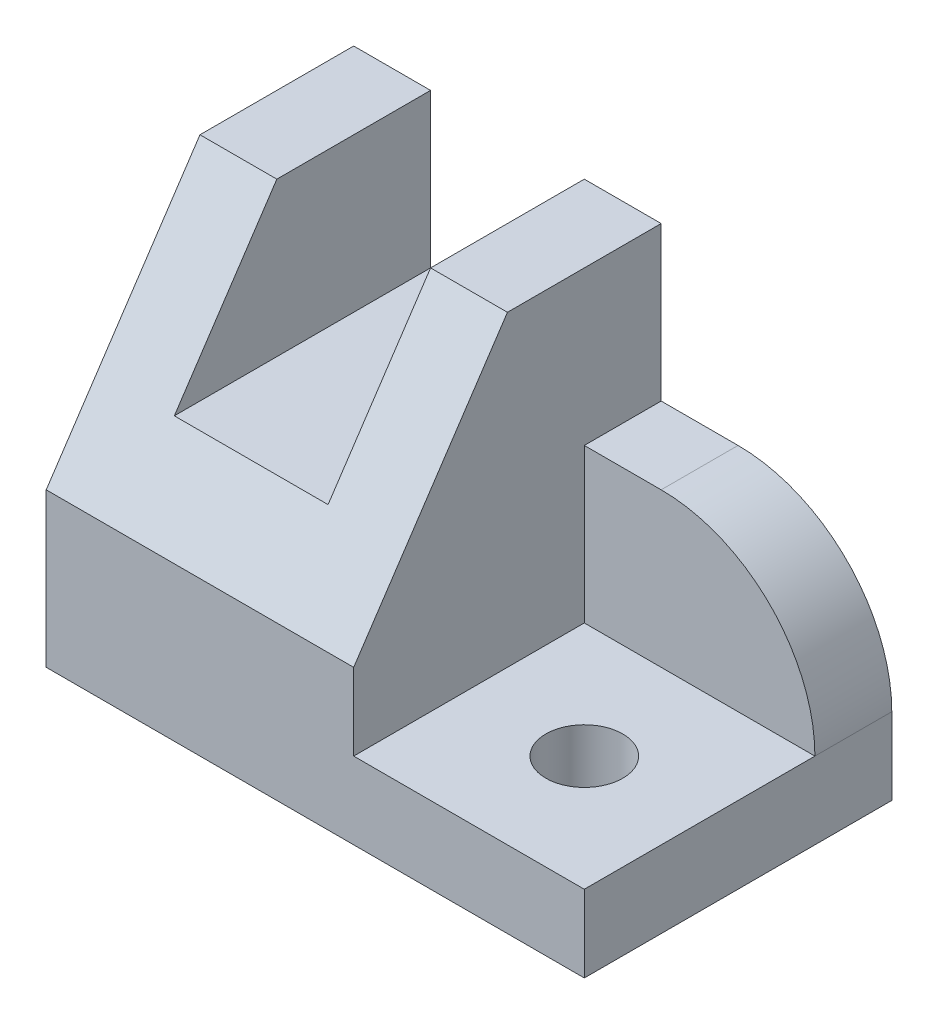
ISO-10303-21;
HEADER;
FILE_DESCRIPTION(('STEP AP214'),'2;1');
FILE_NAME('part.step','',(''),(''),'','','');
FILE_SCHEMA(('AUTOMOTIVE_DESIGN { 1 0 10303 214 1 1 1 1 }'));
ENDSEC;
DATA;
#1=APPLICATION_CONTEXT('core data for automotive mechanical design processes');
#2=APPLICATION_PROTOCOL_DEFINITION('international standard','automotive_design',2000,#1);
#3=PRODUCT_CONTEXT('',#1,'mechanical');
#4=PRODUCT('Part','Part','',(#3));
#5=PRODUCT_RELATED_PRODUCT_CATEGORY('part','',(#4));
#6=PRODUCT_DEFINITION_FORMATION('','',#4);
#7=PRODUCT_DEFINITION_CONTEXT('part definition',#1,'design');
#8=PRODUCT_DEFINITION('design','',#6,#7);
#9=PRODUCT_DEFINITION_SHAPE('','',#8);
#10=(LENGTH_UNIT() NAMED_UNIT(*) SI_UNIT(.MILLI.,.METRE.));
#11=(NAMED_UNIT(*) PLANE_ANGLE_UNIT() SI_UNIT($,.RADIAN.));
#12=(NAMED_UNIT(*) SI_UNIT($,.STERADIAN.) SOLID_ANGLE_UNIT());
#13=UNCERTAINTY_MEASURE_WITH_UNIT(LENGTH_MEASURE(1.E-05),#10,'distance_accuracy_value','');
#14=(GEOMETRIC_REPRESENTATION_CONTEXT(3) GLOBAL_UNCERTAINTY_ASSIGNED_CONTEXT((#13)) GLOBAL_UNIT_ASSIGNED_CONTEXT((#10,
#11,#12)) REPRESENTATION_CONTEXT('',''));
#15=CARTESIAN_POINT('',(0.,0.,0.));
#16=DIRECTION('',(0.,0.,1.));
#17=DIRECTION('',(1.,0.,0.));
#18=AXIS2_PLACEMENT_3D('',#15,#16,#17);
#19=CARTESIAN_POINT('',(20.,0.,0.));
#20=DIRECTION('',(0.,0.,1.));
#21=DIRECTION('',(1.,0.,0.));
#22=AXIS2_PLACEMENT_3D('',#19,#20,#21);
#23=PLANE('',#22);
#24=DIRECTION('',(0.,-1.,0.));
#25=VECTOR('',#24,1.);
#26=CARTESIAN_POINT('',(15.,0.,0.));
#27=LINE('',#26,#25);
#28=CARTESIAN_POINT('',(15.,20.,0.));
#29=VERTEX_POINT('',#28);
#30=CARTESIAN_POINT('',(15.,9.99999999999999,0.));
#31=VERTEX_POINT('',#30);
#32=EDGE_CURVE('E152',#29,#31,#27,.T.);
#33=ORIENTED_EDGE('',*,*,#32,.F.);
#34=DIRECTION('',(-1.,0.,0.));
#35=VECTOR('',#34,1.);
#36=CARTESIAN_POINT('',(20.,20.,0.));
#37=LINE('',#36,#35);
#38=CARTESIAN_POINT('',(20.,20.,0.));
#39=VERTEX_POINT('',#38);
#40=EDGE_CURVE('E219',#39,#29,#37,.T.);
#41=ORIENTED_EDGE('',*,*,#40,.F.);
#42=DIRECTION('',(0.,1.,0.));
#43=VECTOR('',#42,1.);
#44=CARTESIAN_POINT('',(20.,0.,0.));
#45=LINE('',#44,#43);
#46=CARTESIAN_POINT('',(20.,10.,0.));
#47=VERTEX_POINT('',#46);
#48=EDGE_CURVE('E192',#47,#39,#45,.T.);
#49=ORIENTED_EDGE('',*,*,#48,.F.);
#50=DIRECTION('',(1.,0.,0.));
#51=VECTOR('',#50,1.);
#52=CARTESIAN_POINT('',(20.,10.,0.));
#53=LINE('',#52,#51);
#54=CARTESIAN_POINT('',(25.,10.,0.));
#55=VERTEX_POINT('',#54);
#56=EDGE_CURVE('E157',#47,#55,#53,.T.);
#57=ORIENTED_EDGE('',*,*,#56,.T.);
#58=CARTESIAN_POINT('',(25.,0.,0.));
#59=DIRECTION('',(0.,0.,1.));
#60=DIRECTION('',(1.,0.,0.));
#61=AXIS2_PLACEMENT_3D('',#58,#59,#60);
#62=CIRCLE('',#61,10.);
#63=CARTESIAN_POINT('',(35.,0.,0.));
#64=VERTEX_POINT('',#63);
#65=EDGE_CURVE('E58',#55,#64,#62,.F.);
#66=ORIENTED_EDGE('',*,*,#65,.T.);
#67=DIRECTION('',(0.,1.,0.));
#68=VECTOR('',#67,1.);
#69=CARTESIAN_POINT('',(35.,-5.,0.));
#70=LINE('',#69,#68);
#71=CARTESIAN_POINT('',(35.,-5.,0.));
#72=VERTEX_POINT('',#71);
#73=EDGE_CURVE('E189',#72,#64,#70,.T.);
#74=ORIENTED_EDGE('',*,*,#73,.F.);
#75=DIRECTION('',(1.,0.,0.));
#76=VECTOR('',#75,1.);
#77=CARTESIAN_POINT('',(0.,-5.,0.));
#78=LINE('',#77,#76);
#79=CARTESIAN_POINT('',(0.,-5.,0.));
#80=VERTEX_POINT('',#79);
#81=EDGE_CURVE('E175',#80,#72,#78,.T.);
#82=ORIENTED_EDGE('',*,*,#81,.F.);
#83=DIRECTION('',(0.,1.,0.));
#84=VECTOR('',#83,1.);
#85=CARTESIAN_POINT('',(0.,0.,0.));
#86=LINE('',#85,#84);
#87=CARTESIAN_POINT('',(0.,20.,0.));
#88=VERTEX_POINT('',#87);
#89=EDGE_CURVE('E191',#80,#88,#86,.T.);
#90=ORIENTED_EDGE('',*,*,#89,.T.);
#91=CARTESIAN_POINT('',(5.,20.,0.));
#92=VERTEX_POINT('',#91);
#93=EDGE_CURVE('E149',#92,#88,#37,.T.);
#94=ORIENTED_EDGE('',*,*,#93,.F.);
#95=DIRECTION('',(0.,1.,0.));
#96=VECTOR('',#95,1.);
#97=CARTESIAN_POINT('',(5.00000000000001,0.,0.));
#98=LINE('',#97,#96);
#99=CARTESIAN_POINT('',(5.,9.99999999999999,0.));
#100=VERTEX_POINT('',#99);
#101=EDGE_CURVE('E142',#100,#92,#98,.T.);
#102=ORIENTED_EDGE('',*,*,#101,.F.);
#103=DIRECTION('',(-1.,0.,0.));
#104=VECTOR('',#103,1.);
#105=CARTESIAN_POINT('',(20.,9.99999999999999,0.));
#106=LINE('',#105,#104);
#107=EDGE_CURVE('E132',#31,#100,#106,.T.);
#108=ORIENTED_EDGE('',*,*,#107,.F.);
#109=EDGE_LOOP('',(#33,#41,#49,#57,#66,#74,#82,#90,#94,#102,#108));
#110=FACE_BOUND('',#109,.T.);
#111=ADVANCED_FACE('F35',(#110),#23,.F.);
#112=CARTESIAN_POINT('',(20.,20.,0.));
#113=DIRECTION('',(0.,-1.,0.));
#114=DIRECTION('',(0.,0.,-1.));
#115=AXIS2_PLACEMENT_3D('',#112,#113,#114);
#116=PLANE('',#115);
#117=DIRECTION('',(0.,0.,-1.));
#118=VECTOR('',#117,1.);
#119=CARTESIAN_POINT('',(15.,20.,0.));
#120=LINE('',#119,#118);
#121=CARTESIAN_POINT('',(15.,20.,10.));
#122=VERTEX_POINT('',#121);
#123=EDGE_CURVE('E150',#122,#29,#120,.T.);
#124=ORIENTED_EDGE('',*,*,#123,.F.);
#125=DIRECTION('',(-1.,0.,0.));
#126=VECTOR('',#125,1.);
#127=CARTESIAN_POINT('',(20.,20.,10.));
#128=LINE('',#127,#126);
#129=CARTESIAN_POINT('',(20.,20.,10.));
#130=VERTEX_POINT('',#129);
#131=EDGE_CURVE('E216',#130,#122,#128,.T.);
#132=ORIENTED_EDGE('',*,*,#131,.F.);
#133=DIRECTION('',(0.,0.,1.));
#134=VECTOR('',#133,1.);
#135=CARTESIAN_POINT('',(20.,20.,0.));
#136=LINE('',#135,#134);
#137=EDGE_CURVE('E194',#39,#130,#136,.T.);
#138=ORIENTED_EDGE('',*,*,#137,.F.);
#139=ORIENTED_EDGE('',*,*,#40,.T.);
#140=EDGE_LOOP('',(#124,#132,#138,#139));
#141=FACE_BOUND('',#140,.T.);
#142=ADVANCED_FACE('F244',(#141),#116,.F.);
#143=DIRECTION('',(0.,0.,1.));
#144=VECTOR('',#143,1.);
#145=CARTESIAN_POINT('',(5.,20.,0.));
#146=LINE('',#145,#144);
#147=CARTESIAN_POINT('',(5.,20.,10.));
#148=VERTEX_POINT('',#147);
#149=EDGE_CURVE('E138',#92,#148,#146,.T.);
#150=ORIENTED_EDGE('',*,*,#149,.F.);
#151=ORIENTED_EDGE('',*,*,#93,.T.);
#152=DIRECTION('',(0.,0.,1.));
#153=VECTOR('',#152,1.);
#154=CARTESIAN_POINT('',(0.,20.,0.));
#155=LINE('',#154,#153);
#156=CARTESIAN_POINT('',(0.,20.,10.));
#157=VERTEX_POINT('',#156);
#158=EDGE_CURVE('E207',#88,#157,#155,.T.);
#159=ORIENTED_EDGE('',*,*,#158,.T.);
#160=EDGE_CURVE('E215',#148,#157,#128,.T.);
#161=ORIENTED_EDGE('',*,*,#160,.F.);
#162=EDGE_LOOP('',(#150,#151,#159,#161));
#163=FACE_BOUND('',#162,.T.);
#164=ADVANCED_FACE('F276',(#163),#116,.F.);
#165=CARTESIAN_POINT('',(20.,20.,10.));
#166=DIRECTION('',(0.,-0.554700196225229,-0.832050294337844));
#167=DIRECTION('',(0.,0.832050294337844,-0.554700196225229));
#168=AXIS2_PLACEMENT_3D('',#165,#166,#167);
#169=PLANE('',#168);
#170=DIRECTION('',(0.,0.832050294337844,-0.554700196225229));
#171=VECTOR('',#170,1.);
#172=CARTESIAN_POINT('',(15.,20.,10.));
#173=LINE('',#172,#171);
#174=CARTESIAN_POINT('',(15.,9.99999999999999,16.6666666666667));
#175=VERTEX_POINT('',#174);
#176=EDGE_CURVE('E11',#175,#122,#173,.T.);
#177=ORIENTED_EDGE('',*,*,#176,.F.);
#178=DIRECTION('',(1.,0.,0.));
#179=VECTOR('',#178,1.);
#180=CARTESIAN_POINT('',(20.,9.99999999999999,16.6666666666667));
#181=LINE('',#180,#179);
#182=CARTESIAN_POINT('',(5.,9.99999999999999,16.6666666666667));
#183=VERTEX_POINT('',#182);
#184=EDGE_CURVE('E230',#183,#175,#181,.T.);
#185=ORIENTED_EDGE('',*,*,#184,.F.);
#186=DIRECTION('',(0.,-0.832050294337844,0.554700196225229));
#187=VECTOR('',#186,1.);
#188=CARTESIAN_POINT('',(5.,20.,10.));
#189=LINE('',#188,#187);
#190=EDGE_CURVE('E43',#148,#183,#189,.T.);
#191=ORIENTED_EDGE('',*,*,#190,.F.);
#192=ORIENTED_EDGE('',*,*,#160,.T.);
#193=DIRECTION('',(0.,-0.832050294337844,0.554700196225229));
#194=VECTOR('',#193,1.);
#195=CARTESIAN_POINT('',(0.,20.,10.));
#196=LINE('',#195,#194);
#197=CARTESIAN_POINT('',(0.,5.,20.));
#198=VERTEX_POINT('',#197);
#199=EDGE_CURVE('E210',#157,#198,#196,.T.);
#200=ORIENTED_EDGE('',*,*,#199,.T.);
#201=DIRECTION('',(-1.,0.,0.));
#202=VECTOR('',#201,1.);
#203=CARTESIAN_POINT('',(20.,5.,20.));
#204=LINE('',#203,#202);
#205=CARTESIAN_POINT('',(20.,5.,20.));
#206=VERTEX_POINT('',#205);
#207=EDGE_CURVE('E205',#206,#198,#204,.T.);
#208=ORIENTED_EDGE('',*,*,#207,.F.);
#209=DIRECTION('',(0.,-0.832050294337844,0.554700196225229));
#210=VECTOR('',#209,1.);
#211=CARTESIAN_POINT('',(20.,20.,10.));
#212=LINE('',#211,#210);
#213=EDGE_CURVE('E197',#130,#206,#212,.T.);
#214=ORIENTED_EDGE('',*,*,#213,.F.);
#215=ORIENTED_EDGE('',*,*,#131,.T.);
#216=EDGE_LOOP('',(#177,#185,#191,#192,#200,#208,#214,#215));
#217=FACE_BOUND('',#216,.T.);
#218=ADVANCED_FACE('F238',(#217),#169,.F.);
#219=CARTESIAN_POINT('',(0.,0.,0.));
#220=DIRECTION('',(0.,1.,0.));
#221=DIRECTION('',(0.,0.,1.));
#222=AXIS2_PLACEMENT_3D('',#219,#220,#221);
#223=PLANE('',#222);
#224=CARTESIAN_POINT('',(27.5,0.,12.5));
#225=DIRECTION('',(0.,1.,0.));
#226=DIRECTION('',(0.,0.,1.));
#227=AXIS2_PLACEMENT_3D('',#224,#225,#226);
#228=CIRCLE('',#227,2.5);
#229=CARTESIAN_POINT('',(27.5,0.,15.));
#230=VERTEX_POINT('',#229);
#231=EDGE_CURVE('E331',#230,#230,#228,.T.);
#232=ORIENTED_EDGE('',*,*,#231,.F.);
#233=EDGE_LOOP('',(#232));
#234=FACE_BOUND('',#233,.T.);
#235=DIRECTION('',(0.,0.,1.));
#236=VECTOR('',#235,1.);
#237=CARTESIAN_POINT('',(35.,0.,0.));
#238=LINE('',#237,#236);
#239=CARTESIAN_POINT('',(35.,0.,5.));
#240=VERTEX_POINT('',#239);
#241=CARTESIAN_POINT('',(35.,0.,20.));
#242=VERTEX_POINT('',#241);
#243=EDGE_CURVE('E171',#240,#242,#238,.T.);
#244=ORIENTED_EDGE('',*,*,#243,.F.);
#245=DIRECTION('',(-1.,0.,0.));
#246=VECTOR('',#245,1.);
#247=CARTESIAN_POINT('',(20.,0.,5.));
#248=LINE('',#247,#246);
#249=CARTESIAN_POINT('',(20.,0.,5.));
#250=VERTEX_POINT('',#249);
#251=EDGE_CURVE('E164',#240,#250,#248,.T.);
#252=ORIENTED_EDGE('',*,*,#251,.T.);
#253=DIRECTION('',(0.,0.,-1.));
#254=VECTOR('',#253,1.);
#255=CARTESIAN_POINT('',(20.,0.,0.));
#256=LINE('',#255,#254);
#257=CARTESIAN_POINT('',(20.,0.,20.));
#258=VERTEX_POINT('',#257);
#259=EDGE_CURVE('E202',#258,#250,#256,.T.);
#260=ORIENTED_EDGE('',*,*,#259,.F.);
#261=DIRECTION('',(-1.,0.,0.));
#262=VECTOR('',#261,1.);
#263=CARTESIAN_POINT('',(0.,0.,20.));
#264=LINE('',#263,#262);
#265=EDGE_CURVE('E176',#242,#258,#264,.T.);
#266=ORIENTED_EDGE('',*,*,#265,.F.);
#267=EDGE_LOOP('',(#244,#252,#260,#266));
#268=FACE_BOUND('',#267,.T.);
#269=ADVANCED_FACE('F282',(#234,#268),#223,.T.);
#270=CARTESIAN_POINT('',(20.,0.,20.));
#271=DIRECTION('',(0.,0.,-1.));
#272=DIRECTION('',(-1.,0.,0.));
#273=AXIS2_PLACEMENT_3D('',#270,#271,#272);
#274=PLANE('',#273);
#275=DIRECTION('',(0.,-1.,0.));
#276=VECTOR('',#275,1.);
#277=CARTESIAN_POINT('',(0.,0.,20.));
#278=LINE('',#277,#276);
#279=CARTESIAN_POINT('',(0.,-5.,20.));
#280=VERTEX_POINT('',#279);
#281=EDGE_CURVE('E195',#198,#280,#278,.T.);
#282=ORIENTED_EDGE('',*,*,#281,.T.);
#283=DIRECTION('',(-1.,0.,0.));
#284=VECTOR('',#283,1.);
#285=CARTESIAN_POINT('',(0.,-5.,20.));
#286=LINE('',#285,#284);
#287=CARTESIAN_POINT('',(35.,-5.,20.));
#288=VERTEX_POINT('',#287);
#289=EDGE_CURVE('E180',#288,#280,#286,.T.);
#290=ORIENTED_EDGE('',*,*,#289,.F.);
#291=DIRECTION('',(0.,1.,0.));
#292=VECTOR('',#291,1.);
#293=CARTESIAN_POINT('',(35.,-5.,20.));
#294=LINE('',#293,#292);
#295=EDGE_CURVE('E183',#288,#242,#294,.T.);
#296=ORIENTED_EDGE('',*,*,#295,.T.);
#297=ORIENTED_EDGE('',*,*,#265,.T.);
#298=DIRECTION('',(0.,-1.,0.));
#299=VECTOR('',#298,1.);
#300=CARTESIAN_POINT('',(20.,0.,20.));
#301=LINE('',#300,#299);
#302=EDGE_CURVE('E199',#206,#258,#301,.T.);
#303=ORIENTED_EDGE('',*,*,#302,.F.);
#304=ORIENTED_EDGE('',*,*,#207,.T.);
#305=EDGE_LOOP('',(#282,#290,#296,#297,#303,#304));
#306=FACE_BOUND('',#305,.T.);
#307=ADVANCED_FACE('F279',(#306),#274,.F.);
#308=CARTESIAN_POINT('',(20.,0.,0.));
#309=DIRECTION('',(1.,0.,0.));
#310=DIRECTION('',(0.,0.,-1.));
#311=AXIS2_PLACEMENT_3D('',#308,#309,#310);
#312=PLANE('',#311);
#313=DIRECTION('',(0.,0.,-1.));
#314=VECTOR('',#313,1.);
#315=CARTESIAN_POINT('',(20.,10.,5.));
#316=LINE('',#315,#314);
#317=CARTESIAN_POINT('',(20.,10.,5.));
#318=VERTEX_POINT('',#317);
#319=EDGE_CURVE('E167',#318,#47,#316,.T.);
#320=ORIENTED_EDGE('',*,*,#319,.T.);
#321=ORIENTED_EDGE('',*,*,#48,.T.);
#322=ORIENTED_EDGE('',*,*,#137,.T.);
#323=ORIENTED_EDGE('',*,*,#213,.T.);
#324=ORIENTED_EDGE('',*,*,#302,.T.);
#325=ORIENTED_EDGE('',*,*,#259,.T.);
#326=DIRECTION('',(0.,1.,0.));
#327=VECTOR('',#326,1.);
#328=CARTESIAN_POINT('',(20.,0.,5.));
#329=LINE('',#328,#327);
#330=EDGE_CURVE('E158',#250,#318,#329,.T.);
#331=ORIENTED_EDGE('',*,*,#330,.T.);
#332=EDGE_LOOP('',(#320,#321,#322,#323,#324,#325,#331));
#333=FACE_BOUND('',#332,.T.);
#334=ADVANCED_FACE('F248',(#333),#312,.T.);
#335=CARTESIAN_POINT('',(0.,0.,0.));
#336=DIRECTION('',(1.,0.,0.));
#337=DIRECTION('',(0.,0.,-1.));
#338=AXIS2_PLACEMENT_3D('',#335,#336,#337);
#339=PLANE('',#338);
#340=ORIENTED_EDGE('',*,*,#89,.F.);
#341=DIRECTION('',(0.,0.,-1.));
#342=VECTOR('',#341,1.);
#343=CARTESIAN_POINT('',(0.,-5.,0.));
#344=LINE('',#343,#342);
#345=EDGE_CURVE('E172',#280,#80,#344,.T.);
#346=ORIENTED_EDGE('',*,*,#345,.F.);
#347=ORIENTED_EDGE('',*,*,#281,.F.);
#348=ORIENTED_EDGE('',*,*,#199,.F.);
#349=ORIENTED_EDGE('',*,*,#158,.F.);
#350=EDGE_LOOP('',(#340,#346,#347,#348,#349));
#351=FACE_BOUND('',#350,.T.);
#352=ADVANCED_FACE('F271',(#351),#339,.F.);
#353=CARTESIAN_POINT('',(35.,-5.,0.));
#354=DIRECTION('',(-1.,0.,0.));
#355=DIRECTION('',(0.,0.,1.));
#356=AXIS2_PLACEMENT_3D('',#353,#354,#355);
#357=PLANE('',#356);
#358=ORIENTED_EDGE('',*,*,#73,.T.);
#359=DIRECTION('',(0.,0.,-1.));
#360=VECTOR('',#359,1.);
#361=CARTESIAN_POINT('',(35.,0.,5.));
#362=LINE('',#361,#360);
#363=EDGE_CURVE('E226',#64,#240,#362,.F.);
#364=ORIENTED_EDGE('',*,*,#363,.T.);
#365=ORIENTED_EDGE('',*,*,#243,.T.);
#366=ORIENTED_EDGE('',*,*,#295,.F.);
#367=DIRECTION('',(0.,0.,1.));
#368=VECTOR('',#367,1.);
#369=CARTESIAN_POINT('',(35.,-5.,0.));
#370=LINE('',#369,#368);
#371=EDGE_CURVE('E178',#72,#288,#370,.T.);
#372=ORIENTED_EDGE('',*,*,#371,.F.);
#373=EDGE_LOOP('',(#358,#364,#365,#366,#372));
#374=FACE_BOUND('',#373,.T.);
#375=ADVANCED_FACE('F261',(#374),#357,.F.);
#376=CARTESIAN_POINT('',(0.,-5.,0.));
#377=DIRECTION('',(0.,1.,0.));
#378=DIRECTION('',(0.,0.,1.));
#379=AXIS2_PLACEMENT_3D('',#376,#377,#378);
#380=PLANE('',#379);
#381=CARTESIAN_POINT('',(27.5,-5.,12.5));
#382=DIRECTION('',(0.,1.,0.));
#383=DIRECTION('',(0.,0.,1.));
#384=AXIS2_PLACEMENT_3D('',#381,#382,#383);
#385=CIRCLE('',#384,2.5);
#386=CARTESIAN_POINT('',(27.5,-5.,15.));
#387=VERTEX_POINT('',#386);
#388=EDGE_CURVE('E236',#387,#387,#385,.T.);
#389=ORIENTED_EDGE('',*,*,#388,.T.);
#390=EDGE_LOOP('',(#389));
#391=FACE_BOUND('',#390,.T.);
#392=ORIENTED_EDGE('',*,*,#345,.T.);
#393=ORIENTED_EDGE('',*,*,#81,.T.);
#394=ORIENTED_EDGE('',*,*,#371,.T.);
#395=ORIENTED_EDGE('',*,*,#289,.T.);
#396=EDGE_LOOP('',(#392,#393,#394,#395));
#397=FACE_BOUND('',#396,.T.);
#398=ADVANCED_FACE('F267',(#391,#397),#380,.F.);
#399=CARTESIAN_POINT('',(20.,10.,5.));
#400=DIRECTION('',(0.,1.,0.));
#401=DIRECTION('',(-1.,0.,0.));
#402=AXIS2_PLACEMENT_3D('',#399,#400,#401);
#403=PLANE('',#402);
#404=DIRECTION('',(1.,0.,0.));
#405=VECTOR('',#404,1.);
#406=CARTESIAN_POINT('',(20.,10.,5.));
#407=LINE('',#406,#405);
#408=CARTESIAN_POINT('',(25.,10.,5.));
#409=VERTEX_POINT('',#408);
#410=EDGE_CURVE('E161',#318,#409,#407,.T.);
#411=ORIENTED_EDGE('',*,*,#410,.T.);
#412=DIRECTION('',(0.,0.,-1.));
#413=VECTOR('',#412,1.);
#414=CARTESIAN_POINT('',(25.,10.,0.));
#415=LINE('',#414,#413);
#416=EDGE_CURVE('E222',#409,#55,#415,.T.);
#417=ORIENTED_EDGE('',*,*,#416,.T.);
#418=ORIENTED_EDGE('',*,*,#56,.F.);
#419=ORIENTED_EDGE('',*,*,#319,.F.);
#420=EDGE_LOOP('',(#411,#417,#418,#419));
#421=FACE_BOUND('',#420,.T.);
#422=ADVANCED_FACE('F251',(#421),#403,.T.);
#423=CARTESIAN_POINT('',(0.,0.,5.));
#424=DIRECTION('',(0.,0.,-1.));
#425=DIRECTION('',(-1.,0.,0.));
#426=AXIS2_PLACEMENT_3D('',#423,#424,#425);
#427=PLANE('',#426);
#428=ORIENTED_EDGE('',*,*,#251,.F.);
#429=CARTESIAN_POINT('',(25.,0.,5.));
#430=DIRECTION('',(0.,0.,-1.));
#431=DIRECTION('',(-1.,0.,0.));
#432=AXIS2_PLACEMENT_3D('',#429,#430,#431);
#433=CIRCLE('',#432,10.);
#434=EDGE_CURVE('E228',#240,#409,#433,.F.);
#435=ORIENTED_EDGE('',*,*,#434,.T.);
#436=ORIENTED_EDGE('',*,*,#410,.F.);
#437=ORIENTED_EDGE('',*,*,#330,.F.);
#438=EDGE_LOOP('',(#428,#435,#436,#437));
#439=FACE_BOUND('',#438,.T.);
#440=ADVANCED_FACE('F255',(#439),#427,.F.);
#441=CARTESIAN_POINT('',(25.,0.,5.));
#442=DIRECTION('',(0.,0.,1.));
#443=DIRECTION('',(1.,0.,0.));
#444=AXIS2_PLACEMENT_3D('',#441,#442,#443);
#445=CYLINDRICAL_SURFACE('',#444,10.);
#446=ORIENTED_EDGE('',*,*,#434,.F.);
#447=ORIENTED_EDGE('',*,*,#363,.F.);
#448=ORIENTED_EDGE('',*,*,#65,.F.);
#449=ORIENTED_EDGE('',*,*,#416,.F.);
#450=EDGE_LOOP('',(#446,#447,#448,#449));
#451=FACE_BOUND('',#450,.T.);
#452=ADVANCED_FACE('F37',(#451),#445,.T.);
#453=CARTESIAN_POINT('',(15.,30.,20.));
#454=DIRECTION('',(-1.,0.,0.));
#455=DIRECTION('',(0.,-1.,0.));
#456=AXIS2_PLACEMENT_3D('',#453,#454,#455);
#457=PLANE('',#456);
#458=ORIENTED_EDGE('',*,*,#32,.T.);
#459=DIRECTION('',(0.,0.,-1.));
#460=VECTOR('',#459,1.);
#461=CARTESIAN_POINT('',(15.,9.99999999999999,20.));
#462=LINE('',#461,#460);
#463=EDGE_CURVE('E135',#175,#31,#462,.T.);
#464=ORIENTED_EDGE('',*,*,#463,.F.);
#465=ORIENTED_EDGE('',*,*,#176,.T.);
#466=ORIENTED_EDGE('',*,*,#123,.T.);
#467=EDGE_LOOP('',(#458,#464,#465,#466));
#468=FACE_BOUND('',#467,.T.);
#469=ADVANCED_FACE('F234',(#468),#457,.T.);
#470=CARTESIAN_POINT('',(5.,30.,20.));
#471=DIRECTION('',(1.,0.,0.));
#472=DIRECTION('',(0.,1.,0.));
#473=AXIS2_PLACEMENT_3D('',#470,#471,#472);
#474=PLANE('',#473);
#475=ORIENTED_EDGE('',*,*,#101,.T.);
#476=ORIENTED_EDGE('',*,*,#149,.T.);
#477=ORIENTED_EDGE('',*,*,#190,.T.);
#478=DIRECTION('',(0.,0.,-1.));
#479=VECTOR('',#478,1.);
#480=CARTESIAN_POINT('',(5.,9.99999999999999,20.));
#481=LINE('',#480,#479);
#482=EDGE_CURVE('E50',#183,#100,#481,.T.);
#483=ORIENTED_EDGE('',*,*,#482,.T.);
#484=EDGE_LOOP('',(#475,#476,#477,#483));
#485=FACE_BOUND('',#484,.T.);
#486=ADVANCED_FACE('F141',(#485),#474,.T.);
#487=CARTESIAN_POINT('',(5.,9.99999999999999,20.));
#488=DIRECTION('',(0.,1.,0.));
#489=DIRECTION('',(-1.,0.,0.));
#490=AXIS2_PLACEMENT_3D('',#487,#488,#489);
#491=PLANE('',#490);
#492=ORIENTED_EDGE('',*,*,#107,.T.);
#493=ORIENTED_EDGE('',*,*,#482,.F.);
#494=ORIENTED_EDGE('',*,*,#184,.T.);
#495=ORIENTED_EDGE('',*,*,#463,.T.);
#496=EDGE_LOOP('',(#492,#493,#494,#495));
#497=FACE_BOUND('',#496,.T.);
#498=ADVANCED_FACE('F133',(#497),#491,.T.);
#499=CARTESIAN_POINT('',(27.5,-5.,12.5));
#500=DIRECTION('',(0.,1.,0.));
#501=DIRECTION('',(0.,0.,1.));
#502=AXIS2_PLACEMENT_3D('',#499,#500,#501);
#503=CYLINDRICAL_SURFACE('',#502,2.5);
#504=ORIENTED_EDGE('',*,*,#388,.F.);
#505=EDGE_LOOP('',(#504));
#506=FACE_BOUND('',#505,.T.);
#507=ORIENTED_EDGE('',*,*,#231,.T.);
#508=EDGE_LOOP('',(#507));
#509=FACE_BOUND('',#508,.T.);
#510=ADVANCED_FACE('F323',(#506,#509),#503,.F.);
#511=CLOSED_SHELL('',(#111,#142,#164,#218,#269,#307,#334,#352,#375,#398,#422,#440,#452,#469,
#486,#498,#510));
#512=MANIFOLD_SOLID_BREP('B2',#511);
#513=ADVANCED_BREP_SHAPE_REPRESENTATION('',(#18,#512),#14);
#514=SHAPE_DEFINITION_REPRESENTATION(#9,#513);
ENDSEC;
END-ISO-10303-21;
